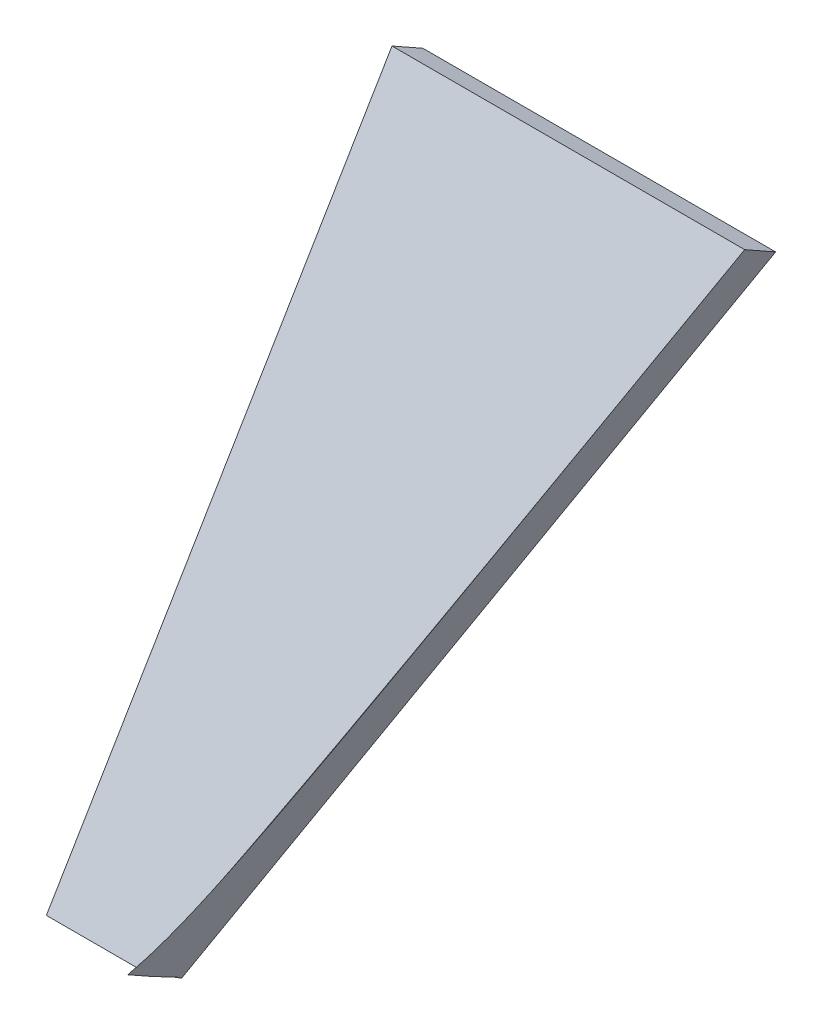
ISO-10303-21;
HEADER;
FILE_DESCRIPTION(('STEP AP214'),'2;1');
FILE_NAME('part.step','',(''),(''),'','','');
FILE_SCHEMA(('AUTOMOTIVE_DESIGN { 1 0 10303 214 1 1 1 1 }'));
ENDSEC;
DATA;
#1=APPLICATION_CONTEXT('core data for automotive mechanical design processes');
#2=APPLICATION_PROTOCOL_DEFINITION('international standard','automotive_design',2000,#1);
#3=PRODUCT_CONTEXT('',#1,'mechanical');
#4=PRODUCT('Part','Part','',(#3));
#5=PRODUCT_RELATED_PRODUCT_CATEGORY('part','',(#4));
#6=PRODUCT_DEFINITION_FORMATION('','',#4);
#7=PRODUCT_DEFINITION_CONTEXT('part definition',#1,'design');
#8=PRODUCT_DEFINITION('design','',#6,#7);
#9=PRODUCT_DEFINITION_SHAPE('','',#8);
#10=(LENGTH_UNIT() NAMED_UNIT(*) SI_UNIT(.MILLI.,.METRE.));
#11=(NAMED_UNIT(*) PLANE_ANGLE_UNIT() SI_UNIT($,.RADIAN.));
#12=(NAMED_UNIT(*) SI_UNIT($,.STERADIAN.) SOLID_ANGLE_UNIT());
#13=UNCERTAINTY_MEASURE_WITH_UNIT(LENGTH_MEASURE(1.E-05),#10,'distance_accuracy_value','');
#14=(GEOMETRIC_REPRESENTATION_CONTEXT(3) GLOBAL_UNCERTAINTY_ASSIGNED_CONTEXT((#13)) GLOBAL_UNIT_ASSIGNED_CONTEXT((#10,
#11,#12)) REPRESENTATION_CONTEXT('',''));
#15=CARTESIAN_POINT('',(0.,0.,0.));
#16=DIRECTION('',(0.,0.,1.));
#17=DIRECTION('',(1.,0.,0.));
#18=AXIS2_PLACEMENT_3D('',#15,#16,#17);
#19=CARTESIAN_POINT('',(48.6776760325675,362.607329490371,21.4180803513587));
#20=DIRECTION('',(0.915166256682117,0.0180699960875279,0.402671327352517));
#21=DIRECTION('',(0.402737084535447,0.,-0.91531570550269));
#22=AXIS2_PLACEMENT_3D('',#19,#20,#21);
#23=PLANE('',#22);
#24=DIRECTION('',(0.386982631379482,-0.318859858880206,-0.865201036410329));
#25=VECTOR('',#24,1.);
#26=CARTESIAN_POINT('',(23.4275750295006,39.9147073013639,93.2858615179995));
#27=LINE('',#26,#25);
#28=CARTESIAN_POINT('',(33.7053515526385,31.4461867373069,70.3072000000032));
#29=VERTEX_POINT('',#28);
#30=CARTESIAN_POINT('',(29.0416436027537,35.2889154237541,80.7341407062869));
#31=VERTEX_POINT('',#30);
#32=EDGE_CURVE('E110',#29,#31,#27,.F.);
#33=ORIENTED_EDGE('',*,*,#32,.T.);
#34=DIRECTION('',(0.132448179385618,0.930040822643922,-0.342755813945221));
#35=VECTOR('',#34,1.);
#36=CARTESIAN_POINT('',(72.3987098741328,339.738865355184,-31.4673754569251));
#37=LINE('',#36,#35);
#38=CARTESIAN_POINT('',(76.0658040141246,365.488915423754,-40.9572592937362));
#39=VERTEX_POINT('',#38);
#40=EDGE_CURVE('E111',#31,#39,#37,.T.);
#41=ORIENTED_EDGE('',*,*,#40,.T.);
#42=DIRECTION('',(0.386982631379482,-0.318859858880206,-0.865201036410329));
#43=VECTOR('',#42,1.);
#44=CARTESIAN_POINT('',(106.513451062562,340.401142345952,-109.030949548665));
#45=LINE('',#44,#43);
#46=CARTESIAN_POINT('',(80.7295119640094,361.646186737307,-51.3842000000199));
#47=VERTEX_POINT('',#46);
#48=EDGE_CURVE('E178',#39,#47,#45,.T.);
#49=ORIENTED_EDGE('',*,*,#48,.T.);
#50=DIRECTION('',(0.132448179385618,0.930040822643922,-0.342755813945221));
#51=VECTOR('',#50,1.);
#52=CARTESIAN_POINT('',(76.9806046329947,335.321650799356,-41.6825960247318));
#53=LINE('',#52,#51);
#54=EDGE_CURVE('E102',#29,#47,#53,.T.);
#55=ORIENTED_EDGE('',*,*,#54,.F.);
#56=EDGE_LOOP('',(#33,#41,#49,#55));
#57=FACE_BOUND('',#56,.T.);
#58=ADVANCED_FACE('F38',(#57),#23,.F.);
#59=CARTESIAN_POINT('',(159.440890218229,313.348268491755,89.3256315210229));
#60=DIRECTION('',(-0.843459103537497,0.255501074852022,-0.472541999624567));
#61=DIRECTION('',(-0.488764700454788,0.,0.872415650701741));
#62=AXIS2_PLACEMENT_3D('',#59,#60,#61);
#63=PLANE('',#62);
#64=CARTESIAN_POINT('',(248.225430882982,365.488915423754,-40.9572592937362));
#65=DIRECTION('',(0.387961074909248,-0.318717649307973,-0.864815161970962));
#66=VECTOR('',#65,1.);
#67=LINE('',#64,#66);
#68=CARTESIAN_POINT('',(248.225430882982,365.488915423754,-40.9572592937363));
#69=VERTEX_POINT('',#68);
#70=CARTESIAN_POINT('',(252.903016686641,361.646186737307,-51.3842000000199));
#71=VERTEX_POINT('',#70);
#72=EDGE_CURVE('E125',#69,#71,#67,.T.);
#73=ORIENTED_EDGE('',*,*,#72,.F.);
#74=CARTESIAN_POINT('',(76.4650627459342,37.7570445086745,88.4217184450691));
#75=CARTESIAN_POINT('',(76.9237098494051,38.4218058241165,87.9624939860993));
#76=CARTESIAN_POINT('',(77.3802011448807,39.0930954947955,87.5106473637279));
#77=CARTESIAN_POINT('',(78.2890693038996,40.4472888391063,86.6205777657977));
#78=CARTESIAN_POINT('',(78.7414465188904,41.1301915061131,86.1823536186491));
#79=CARTESIAN_POINT('',(79.6412052508016,42.5045153004235,85.3194282340254));
#80=CARTESIAN_POINT('',(80.0885966175857,43.1959100300691,84.8946951420546));
#81=CARTESIAN_POINT('',(80.9798239559399,44.5877723079918,84.0564807524007));
#82=CARTESIAN_POINT('',(81.4236598421538,45.288240073035,83.6429997242777));
#83=CARTESIAN_POINT('',(82.30744130296,46.6962630233919,82.8268137731272));
#84=CARTESIAN_POINT('',(82.7473912035108,47.4038077504963,82.4240954738224));
#85=CARTESIAN_POINT('',(83.6242375226161,48.8259813429855,81.6279395151044));
#86=CARTESIAN_POINT('',(84.0611338986766,49.5406103066242,81.2345019846662));
#87=CARTESIAN_POINT('',(85.3671210385411,51.693097272229,80.0672321772355));
#88=CARTESIAN_POINT('',(86.2320043160742,53.1403459400929,79.3059874963373));
#89=CARTESIAN_POINT('',(87.9521386012138,56.0543540205828,77.8112405193988));
#90=CARTESIAN_POINT('',(88.8073908872444,57.5211107859452,77.0777345100861));
#91=CARTESIAN_POINT('',(90.5099518978086,60.4704469897608,75.6334565113988));
#92=CARTESIAN_POINT('',(91.3572601641908,61.9530273303822,74.9226858275944));
#93=CARTESIAN_POINT('',(93.0431429167668,64.927290403516,73.5216553507168));
#94=CARTESIAN_POINT('',(93.8817334200428,66.4189429704802,72.8313506577536));
#95=CARTESIAN_POINT('',(95.5535519531764,69.4129557991991,71.4661025615243));
#96=CARTESIAN_POINT('',(96.3867781917259,70.9153193172114,70.7911641162778));
#97=CARTESIAN_POINT('',(98.048712969516,73.9288584356204,69.4541156963437));
#98=CARTESIAN_POINT('',(98.8774201644039,75.440036408096,68.7920094038161));
#99=CARTESIAN_POINT('',(100.53097516091,78.4696289745528,67.4785984088088));
#100=CARTESIAN_POINT('',(101.355822149463,79.9880449681219,66.8272959143518));
#101=CARTESIAN_POINT('',(103.002168396385,83.0307892595564,65.5338631759603));
#102=CARTESIAN_POINT('',(103.823667339026,84.5551180897171,64.8917337833899));
#103=CARTESIAN_POINT('',(105.463712559817,87.6085637051137,63.6153341502717));
#104=CARTESIAN_POINT('',(106.282258942264,89.1376803175894,62.9810636301499));
#105=CARTESIAN_POINT('',(108.071327970023,92.4894126104915,61.599947548646));
#106=CARTESIAN_POINT('',(109.041332559426,94.312873930306,60.8544839189142));
#107=CARTESIAN_POINT('',(110.978207966157,97.9642393356099,59.3715524354702));
#108=CARTESIAN_POINT('',(111.945079303277,99.792142585794,58.6340832023166));
#109=CARTESIAN_POINT('',(113.876218877387,103.451711934485,57.1658256665849));
#110=CARTESIAN_POINT('',(114.840487388684,105.283377597543,56.43503663894));
#111=CARTESIAN_POINT('',(116.766858304653,108.949937890108,54.9790708398144));
#112=CARTESIAN_POINT('',(117.728960818989,110.784832347361,54.253893779454));
#113=CARTESIAN_POINT('',(119.651363181058,114.457432587176,52.8082773798162));
#114=CARTESIAN_POINT('',(120.611663026165,116.295138373827,52.0878380474387));
#115=CARTESIAN_POINT('',(122.531349526701,119.974153418643,50.6505377503055));
#116=CARTESIAN_POINT('',(123.49073516085,121.81546425474,49.9336794616554));
#117=CARTESIAN_POINT('',(125.408213378298,125.50021386011,48.5034214652317));
#118=CARTESIAN_POINT('',(126.366305903981,127.343652717826,47.7900219081212));
#119=CARTESIAN_POINT('',(128.281364728174,131.032351826791,46.3662178600927));
#120=CARTESIAN_POINT('',(129.238330990905,132.877612132652,45.6558134625657));
#121=CARTESIAN_POINT('',(131.151274778013,136.569692251643,44.237612723833));
#122=CARTESIAN_POINT('',(132.107252284831,138.416512091444,43.5298164283898));
#123=CARTESIAN_POINT('',(134.018329919515,142.11148896655,42.1165129211272));
#124=CARTESIAN_POINT('',(134.973430044647,143.959646005988,41.4110057164234));
#125=CARTESIAN_POINT('',(138.303149521347,150.407392784346,38.9539204763245));
#126=CARTESIAN_POINT('',(140.675778333195,155.009982991742,37.207517773007));
#127=CARTESIAN_POINT('',(145.417508627697,164.220283932487,33.7237770797896));
#128=CARTESIAN_POINT('',(147.786610174765,168.827994569578,31.9864389228679));
#129=CARTESIAN_POINT('',(152.522165862576,178.047281688539,28.5185783131634));
#130=CARTESIAN_POINT('',(154.888620026371,182.658858136124,26.7880558006954));
#131=CARTESIAN_POINT('',(159.619510448463,191.884990171958,23.3322234222675));
#132=CARTESIAN_POINT('',(161.983946709009,196.499545756876,21.6069135504936));
#133=CARTESIAN_POINT('',(166.710542061945,205.729607604762,18.1608724422317));
#134=CARTESIAN_POINT('',(169.072701622499,210.3451131766,16.440139996411));
#135=CARTESIAN_POINT('',(173.79578263571,219.577979212638,13.0018879839825));
#136=CARTESIAN_POINT('',(176.156704083479,224.195339684038,11.2843684299955));
#137=CARTESIAN_POINT('',(180.877549607785,233.431544660472,7.85191197929654));
#138=CARTESIAN_POINT('',(183.237473682056,238.050389168838,6.13697508843112));
#139=CARTESIAN_POINT('',(187.956506804873,247.289277088235,2.70920431931747));
#140=CARTESIAN_POINT('',(190.315615853109,251.909320499721,0.996370441866665));
#141=CARTESIAN_POINT('',(195.03323000542,261.15052287566,-2.42761613509736));
#142=CARTESIAN_POINT('',(197.391735090329,265.771681868198,-4.13876878521728));
#143=CARTESIAN_POINT('',(202.108184629456,275.014810946128,-7.5596348395126));
#144=CARTESIAN_POINT('',(204.46612908433,279.63678103056,-9.26934824537951));
#145=CARTESIAN_POINT('',(209.181548447817,288.881401816009,-12.6875689392685));
#146=CARTESIAN_POINT('',(211.539023356779,293.504052516516,-14.3960762281908));
#147=CARTESIAN_POINT('',(216.253576813876,302.74993022492,-17.8120717192517));
#148=CARTESIAN_POINT('',(218.61065536215,307.373157232612,-19.5195599217525));
#149=CARTESIAN_POINT('',(223.325188864354,316.621502620752,-22.9341855325464));
#150=CARTESIAN_POINT('',(225.682643716289,321.24662115014,-24.6413226782551));
#151=CARTESIAN_POINT('',(230.397264974249,330.497282097516,-28.0548529166103));
#152=CARTESIAN_POINT('',(232.754431380169,335.122824515657,-29.761246008988));
#153=CARTESIAN_POINT('',(237.468516343273,344.37427646804,-33.1733913008018));
#154=CARTESIAN_POINT('',(239.825434900284,349.000186002534,-34.8791434997948));
#155=CARTESIAN_POINT('',(244.539056625559,358.252327296986,-38.2900892161125));
#156=CARTESIAN_POINT('',(246.895759793602,362.878559057266,-39.9952827328709));
#157=CARTESIAN_POINT('',(249.2523699291,367.504926406603,-41.7002368798003));
#158=B_SPLINE_CURVE_WITH_KNOTS('',3,(#74,#75,#76,#77,#78,#79,#80,#81,#82,#83,#84,#85,#86,#87,
#88,#89,#90,#91,#92,#93,#94,#95,#96,#97,#98,#99,#100,#101,#102,#103,#104,#105,#106,#107,#108,
#109,#110,#111,#112,#113,#114,#115,#116,#117,#118,#119,#120,#121,#122,#123,#124,#125,#126,#127,
#128,#129,#130,#131,#132,#133,#134,#135,#136,#137,#138,#139,#140,#141,#142,#143,#144,#145,#146,
#147,#148,#149,#150,#151,#152,#153,#154,#155,#156,#157),.UNSPECIFIED.,.F.,.F.,(4,2,2,2,2,2,2,2,
2,2,2,2,2,2,2,2,2,2,2,2,2,2,2,2,2,2,2,2,2,2,2,2,2,2,2,2,2,2,2,2,2,4),(0.,2.7870663288007,
5.5738922913037,8.35355733641403,11.1332889140867,13.9093878882142,16.6855254191084,
22.2346883091175,27.7831057046947,33.3318411468124,38.8673349337237,44.4045901718762,
49.9434114672593,55.4833511467075,61.0238016956651,66.5640545777319,73.1514952818573,
79.737780619928,86.3233423882586,92.9085628748712,99.4937929497782,106.08337009027,
112.673231740612,119.263297369365,125.853478083868,132.443679264238,148.837810935334,
165.231639456852,181.625324095476,198.018990442335,214.40778018347,230.7966341677,
247.185525196582,263.574422437805,279.963787577759,296.353133428769,312.742467034647,
329.131794812544,345.526083006663,361.920377120459,378.314682551759,394.709004550761),.UNSPECIFIED.);
#159=CARTESIAN_POINT('',(76.4649474943417,37.7569247347642,88.4218594113332));
#160=VERTEX_POINT('',#159);
#161=EDGE_CURVE('E101',#160,#69,#158,.T.);
#162=ORIENTED_EDGE('',*,*,#161,.F.);
#163=CARTESIAN_POINT('',(76.4645015687253,37.7566556156862,88.4225098423851));
#164=CARTESIAN_POINT('',(77.1206727624281,37.1658739689707,86.9318509935241));
#165=CARTESIAN_POINT('',(77.7864505171305,36.5978029603624,85.4363245381845));
#166=CARTESIAN_POINT('',(79.1368548606122,35.5106059722626,82.4380919211356));
#167=CARTESIAN_POINT('',(79.8214613125511,34.9914301437415,80.935394749358));
#168=CARTESIAN_POINT('',(81.2133140137253,34.0023246394659,77.9162168727887));
#169=CARTESIAN_POINT('',(81.9206405034792,33.5326022345681,76.3997050137938));
#170=CARTESIAN_POINT('',(83.356214651918,32.6474745858831,73.3587072800595));
#171=CARTESIAN_POINT('',(84.0844832248557,32.232126116247,71.8342147721315));
#172=CARTESIAN_POINT('',(84.8229527318621,31.8457880720957,70.3072000000032));
#173=B_SPLINE_CURVE_WITH_KNOTS('',3,(#163,#164,#165,#166,#167,#168,#169,#170,#171,#172),
.UNSPECIFIED.,.F.,.F.,(4,2,2,2,4),(0.,5.19751514895784,10.3896726887829,15.6027912540607,
20.8213103670181),.UNSPECIFIED.);
#174=CARTESIAN_POINT('',(84.0794722396863,32.2463858540291,71.850824236441));
#175=VERTEX_POINT('',#174);
#176=EDGE_CURVE('E83',#160,#175,#173,.T.);
#177=ORIENTED_EDGE('',*,*,#176,.T.);
#178=CARTESIAN_POINT('',(84.4759919189772,33.2170760786243,71.6679527295155));
#179=CARTESIAN_POINT('',(84.4031281758677,33.0391499723233,71.7018063891946));
#180=CARTESIAN_POINT('',(84.3303397813614,32.8611609507864,71.7354915381895));
#181=CARTESIAN_POINT('',(84.1849162112601,32.5050559368257,71.802519697102));
#182=CARTESIAN_POINT('',(84.1122810356676,32.3269399444002,71.8358627070144));
#183=CARTESIAN_POINT('',(83.904930400756,31.8177459224392,71.9306525050785));
#184=CARTESIAN_POINT('',(83.7704058225257,31.4865108839534,71.9916736879978));
#185=CARTESIAN_POINT('',(83.6361580842511,31.1550511361274,72.0520792290077));
#186=B_SPLINE_CURVE_WITH_KNOTS('',3,(#178,#179,#180,#181,#182,#183,#184,#185),.UNSPECIFIED.,.F.,
.F.,(4,2,2,4),(0.,0.585675611794022,1.17135123232062,2.25939010699336),.UNSPECIFIED.);
#187=CARTESIAN_POINT('',(83.9913918450094,32.0298474875026,71.8910062584913));
#188=VERTEX_POINT('',#187);
#189=EDGE_CURVE('E109',#175,#188,#186,.T.);
#190=ORIENTED_EDGE('',*,*,#189,.T.);
#191=DIRECTION('',(-0.387960554738965,0.318717725023184,0.864815367418203));
#192=VECTOR('',#191,1.);
#193=CARTESIAN_POINT('',(66.6964539925739,46.2380422597703,110.443731369652));
#194=LINE('',#193,#192);
#195=CARTESIAN_POINT('',(84.7019052855513,31.4461867373069,70.3072000000032));
#196=VERTEX_POINT('',#195);
#197=EDGE_CURVE('E105',#188,#196,#194,.F.);
#198=ORIENTED_EDGE('',*,*,#197,.T.);
#199=DIRECTION('',(-0.431238885415012,-0.846576369371367,0.311995952742999));
#200=VECTOR('',#199,1.);
#201=CARTESIAN_POINT('',(198.957925128141,255.745176760147,-12.3556047076606));
#202=LINE('',#201,#200);
#203=EDGE_CURVE('E78',#71,#196,#202,.T.);
#204=ORIENTED_EDGE('',*,*,#203,.F.);
#205=EDGE_LOOP('',(#73,#162,#177,#190,#198,#204));
#206=FACE_BOUND('',#205,.T.);
#207=ADVANCED_FACE('F106',(#206),#63,.F.);
#208=CARTESIAN_POINT('',(252.903016686641,361.646186737307,-51.3842000000199));
#209=DIRECTION('',(0.,0.938307375143637,-0.345802356485694));
#210=DIRECTION('',(-1.,0.,0.));
#211=AXIS2_PLACEMENT_3D('',#208,#209,#210);
#212=PLANE('',#211);
#213=ORIENTED_EDGE('',*,*,#48,.F.);
#214=DIRECTION('',(1.,0.,0.));
#215=VECTOR('',#214,1.);
#216=CARTESIAN_POINT('',(0.,365.488915423754,-40.9572592937362));
#217=LINE('',#216,#215);
#218=EDGE_CURVE('E11',#69,#39,#217,.F.);
#219=ORIENTED_EDGE('',*,*,#218,.F.);
#220=ORIENTED_EDGE('',*,*,#72,.T.);
#221=DIRECTION('',(-1.,0.,0.));
#222=VECTOR('',#221,1.);
#223=CARTESIAN_POINT('',(252.903016686641,361.646186737307,-51.3842000000199));
#224=LINE('',#223,#222);
#225=EDGE_CURVE('E100',#71,#47,#224,.T.);
#226=ORIENTED_EDGE('',*,*,#225,.T.);
#227=EDGE_LOOP('',(#213,#219,#220,#226));
#228=FACE_BOUND('',#227,.T.);
#229=ADVANCED_FACE('F147',(#228),#212,.T.);
#230=CARTESIAN_POINT('',(76.1040017022596,37.1987150096687,80.030306105047));
#231=CARTESIAN_POINT('',(75.7184787465366,36.5615289476017,80.265133676075));
#232=CARTESIAN_POINT('',(75.3318614791169,35.924918810988,80.4997489964223));
#233=CARTESIAN_POINT('',(74.9440913316797,35.2889154237573,80.7341407062856));
#234=B_SPLINE_CURVE_WITH_KNOTS('',3,(#230,#231,#232,#233),.UNSPECIFIED.,.F.,.F.,(4,4),(0.,1.),.UNSPECIFIED.);
#235=DIRECTION('',(-0.670569491439969,0.318916473141183,0.669797611453736));
#236=VECTOR('',#235,1.);
#237=SURFACE_OF_LINEAR_EXTRUSION('',#234,#236);
#238=ORIENTED_EDGE('',*,*,#189,.F.);
#239=CARTESIAN_POINT('',(76.103720618774,37.1981033290765,80.0304503787422));
#240=CARTESIAN_POINT('',(76.4185833888721,36.9761157984924,79.7027208289693));
#241=CARTESIAN_POINT('',(76.734544015875,36.7565407630736,79.3744103907981));
#242=CARTESIAN_POINT('',(77.3710130697318,36.3207044344757,78.7142223627048));
#243=CARTESIAN_POINT('',(77.691537846979,36.1044797528686,78.3823363671488));
#244=CARTESIAN_POINT('',(78.3371940167851,35.6755495941761,77.7149972004301));
#245=CARTESIAN_POINT('',(78.6623419493177,35.4628818467664,77.3795357757947));
#246=CARTESIAN_POINT('',(79.3173001290772,35.0412782955754,76.7050456596863));
#247=CARTESIAN_POINT('',(79.6471270793104,34.832381392931,76.3660088677898));
#248=CARTESIAN_POINT('',(80.3114968871625,34.4185391718917,75.6843679609377));
#249=CARTESIAN_POINT('',(80.6460565922014,34.2136339786535,75.3417559008497));
#250=CARTESIAN_POINT('',(81.3199427585015,33.8080021056658,74.6529644152));
#251=CARTESIAN_POINT('',(81.6592861886519,33.6073168328179,74.3067772025378));
#252=CARTESIAN_POINT('',(82.3427881894011,33.2103590449868,73.6108353672837));
#253=CARTESIAN_POINT('',(82.6869638297622,33.0141292792329,73.2610731189777));
#254=CARTESIAN_POINT('',(83.3801743793942,32.6263247959761,72.5579812546003));
#255=CARTESIAN_POINT('',(83.7292264258763,32.4347942389901,72.2046441790141));
#256=CARTESIAN_POINT('',(84.0794609481138,32.2463986045097,71.8508062723878));
#257=B_SPLINE_CURVE_WITH_KNOTS('',3,(#239,#240,#241,#242,#243,#244,#245,#246,#247,#248,#249,
#250,#251,#252,#253,#254,#255,#256),.UNSPECIFIED.,.F.,.F.,(4,2,2,2,2,2,2,2,4),(0.,
1.51736470139841,3.04597314317774,4.58585847777646,6.1370580416777,7.69961379431085,
9.27357279436505,10.8589877166567,12.455917412912),.UNSPECIFIED.);
#258=CARTESIAN_POINT('',(76.1040017022596,37.1987150096687,80.030306105047));
#259=VERTEX_POINT('',#258);
#260=EDGE_CURVE('E119',#259,#175,#257,.T.);
#261=ORIENTED_EDGE('',*,*,#260,.F.);
#262=CARTESIAN_POINT('',(76.1040017022596,37.1987150096687,80.030306105047));
#263=CARTESIAN_POINT('',(75.7184787465366,36.5615289476017,80.2651336760749));
#264=CARTESIAN_POINT('',(75.3318614791169,35.924918810988,80.4997489964223));
#265=CARTESIAN_POINT('',(74.9440913316797,35.2889154237573,80.7341407062856));
#266=B_SPLINE_CURVE_WITH_KNOTS('',3,(#262,#263,#264,#265),.UNSPECIFIED.,.F.,.F.,(4,4),(0.,1.),.UNSPECIFIED.);
#267=CARTESIAN_POINT('',(74.944091331686,35.2889154237541,80.7341407062869));
#268=VERTEX_POINT('',#267);
#269=EDGE_CURVE('E117',#268,#259,#266,.F.);
#270=ORIENTED_EDGE('',*,*,#269,.F.);
#271=CARTESIAN_POINT('',(74.9440913316825,35.2889154237559,80.7341407062827));
#272=CARTESIAN_POINT('',(75.321087550685,35.1531071377622,80.3656847919879));
#273=CARTESIAN_POINT('',(75.6980820841164,35.0172999968518,79.9972267309896));
#274=CARTESIAN_POINT('',(76.4520646899436,34.7456891154144,79.2603093557925));
#275=CARTESIAN_POINT('',(76.8290527623671,34.6098853748687,78.891850041629));
#276=CARTESIAN_POINT('',(77.5830224636236,34.3382812849796,78.1549301634853));
#277=CARTESIAN_POINT('',(77.9600040924842,34.2024809356175,77.7864695995402));
#278=CARTESIAN_POINT('',(78.7139609240605,33.9308836189142,77.0495472252172));
#279=CARTESIAN_POINT('',(79.0909361268036,33.7950866515543,76.6810854148741));
#280=CARTESIAN_POINT('',(79.8448801235903,33.5234960896741,75.9441605511391));
#281=CARTESIAN_POINT('',(80.2218489176611,33.3877024951353,75.5756974977817));
#282=CARTESIAN_POINT('',(80.9757801145489,33.1161186697157,74.838770151402));
#283=CARTESIAN_POINT('',(81.3527425173929,32.9803284388165,74.470305858414));
#284=CARTESIAN_POINT('',(82.1066609492722,32.7087513314949,73.7333760361568));
#285=CARTESIAN_POINT('',(82.4836169783346,32.5729644550542,73.3649105069219));
#286=CARTESIAN_POINT('',(83.2375226800963,32.3013940474679,72.6279782155547));
#287=CARTESIAN_POINT('',(83.6144723528225,32.1656105163041,72.2595114534566));
#288=CARTESIAN_POINT('',(83.9914203759821,32.0298281057092,71.8910425908979));
#289=B_SPLINE_CURVE_WITH_KNOTS('',3,(#271,#272,#273,#274,#275,#276,#277,#278,#279,#280,#281,
#282,#283,#284,#285,#286,#287,#288),.UNSPECIFIED.,.F.,.F.,(4,2,2,2,2,2,2,2,4),(0.,
1.63308548587105,3.26615754793747,4.8992162226361,6.53226154640214,8.16529355566937,
9.79831228686991,11.4313177764344,13.064310060792),.UNSPECIFIED.);
#290=EDGE_CURVE('E69',#268,#188,#289,.T.);
#291=ORIENTED_EDGE('',*,*,#290,.T.);
#292=EDGE_LOOP('',(#238,#261,#270,#291));
#293=FACE_BOUND('',#292,.T.);
#294=ADVANCED_FACE('F148',(#293),#237,.F.);
#295=CARTESIAN_POINT('',(-34.9249999999667,31.4461867373069,70.3072000000032));
#296=DIRECTION('',(0.,0.938307375143637,-0.345802356485694));
#297=DIRECTION('',(-1.,0.,0.));
#298=AXIS2_PLACEMENT_3D('',#295,#296,#297);
#299=PLANE('',#298);
#300=ORIENTED_EDGE('',*,*,#32,.F.);
#301=DIRECTION('',(-1.,0.,0.));
#302=VECTOR('',#301,1.);
#303=CARTESIAN_POINT('',(-34.9249999999667,31.4461867373069,70.3072000000032));
#304=LINE('',#303,#302);
#305=EDGE_CURVE('E98',#196,#29,#304,.T.);
#306=ORIENTED_EDGE('',*,*,#305,.F.);
#307=ORIENTED_EDGE('',*,*,#197,.F.);
#308=ORIENTED_EDGE('',*,*,#290,.F.);
#309=DIRECTION('',(1.,0.,0.));
#310=VECTOR('',#309,1.);
#311=CARTESIAN_POINT('',(0.,35.2889154237541,80.7341407062869));
#312=LINE('',#311,#310);
#313=EDGE_CURVE('E48',#268,#31,#312,.F.);
#314=ORIENTED_EDGE('',*,*,#313,.T.);
#315=EDGE_LOOP('',(#300,#306,#307,#308,#314));
#316=FACE_BOUND('',#315,.T.);
#317=ADVANCED_FACE('F114',(#316),#299,.F.);
#318=CARTESIAN_POINT('',(0.,348.816340498756,-34.8127741809915));
#319=DIRECTION('',(0.,0.345802356485694,0.938307375143637));
#320=DIRECTION('',(0.,-0.938307375143637,0.345802356485694));
#321=AXIS2_PLACEMENT_3D('',#318,#319,#320);
#322=PLANE('',#321);
#323=ORIENTED_EDGE('',*,*,#40,.F.);
#324=ORIENTED_EDGE('',*,*,#313,.F.);
#325=ORIENTED_EDGE('',*,*,#269,.T.);
#326=CARTESIAN_POINT('',(268.631680721576,405.568697329178,-55.7282004559611));
#327=CARTESIAN_POINT('',(266.475876545784,401.33250053035,-54.1669990049464));
#328=CARTESIAN_POINT('',(264.319836813196,397.096409264806,-52.6058364470061));
#329=CARTESIAN_POINT('',(260.007235771978,388.624460590243,-49.4835975162491));
#330=CARTESIAN_POINT('',(257.850674463359,384.388603181219,-47.9225211434309));
#331=CARTESIAN_POINT('',(253.536979769386,375.917144934433,-44.8004629541727));
#332=CARTESIAN_POINT('',(251.379846384044,371.681544096667,-43.2394811377308));
#333=CARTESIAN_POINT('',(247.064948355213,363.210625603667,-40.1176218685023));
#334=CARTESIAN_POINT('',(244.907183711735,358.975307948429,-38.5567444157139));
#335=CARTESIAN_POINT('',(240.591316640052,350.505693378278,-35.4353656922063));
#336=CARTESIAN_POINT('',(238.433214328483,346.271396411039,-33.8748644022027));
#337=CARTESIAN_POINT('',(234.116234673154,337.803150255581,-30.7539899921408));
#338=CARTESIAN_POINT('',(231.957357329383,333.569201067368,-29.1936168720843));
#339=CARTESIAN_POINT('',(227.638739405691,325.101690086685,-26.0730134022026));
#340=CARTESIAN_POINT('',(225.478998825735,320.868128294231,-24.5127830523834));
#341=CARTESIAN_POINT('',(221.158550957276,312.401438600431,-21.3924822583063));
#342=CARTESIAN_POINT('',(218.997843668694,308.168310699121,-19.8324118140615));
#343=CARTESIAN_POINT('',(212.514074560245,295.469606792795,-15.152451012891));
#344=CARTESIAN_POINT('',(208.189390633974,287.004759876395,-12.0328293531617));
#345=CARTESIAN_POINT('',(199.534510484506,270.077547421222,-5.7945005167964));
#346=CARTESIAN_POINT('',(195.204314261547,261.615181882342,-2.675793340121));
#347=CARTESIAN_POINT('',(188.703252653298,248.923388673028,2.00162060340507));
#348=CARTESIAN_POINT('',(186.535094633815,244.692740029914,3.56077734564823));
#349=CARTESIAN_POINT('',(182.196687029861,236.23238654979,6.67874300128513));
#350=CARTESIAN_POINT('',(180.026437445225,232.002681712854,8.23755191465158));
#351=CARTESIAN_POINT('',(175.683511936241,223.544365974487,11.3547665840766));
#352=CARTESIAN_POINT('',(173.510836010575,219.315755073652,12.9131723399155));
#353=CARTESIAN_POINT('',(169.162646184582,210.859811997455,16.0295125920747));
#354=CARTESIAN_POINT('',(166.987132281009,206.632479823562,17.5874470878533));
#355=CARTESIAN_POINT('',(162.990515524075,198.873840579822,20.4468040583739));
#356=CARTESIAN_POINT('',(161.169916888996,195.342304846645,21.7483108043473));
#357=CARTESIAN_POINT('',(157.526021362263,188.280457337567,24.3508732209626));
#358=CARTESIAN_POINT('',(155.70272446954,184.750145562152,25.6519288914254));
#359=CARTESIAN_POINT('',(152.052996899251,177.69095074806,28.2535136879115));
#360=CARTESIAN_POINT('',(150.22656622342,174.162067708594,29.5540428142256));
#361=CARTESIAN_POINT('',(146.570037791319,167.105979721041,32.1544826256391));
#362=CARTESIAN_POINT('',(144.739940039455,163.578774770943,33.4543933114794));
#363=CARTESIAN_POINT('',(141.075419507209,156.526349159797,36.0534833963261));
#364=CARTESIAN_POINT('',(139.240996732791,153.001128496021,37.3526627963379));
#365=CARTESIAN_POINT('',(135.567006509556,145.953051356762,39.9501503020452));
#366=CARTESIAN_POINT('',(133.727439064946,142.430194879349,41.2484584084521));
#367=CARTESIAN_POINT('',(130.042883822314,135.388766750694,43.8434954980207));
#368=CARTESIAN_POINT('',(128.197898550448,131.87019393596,45.140224909974));
#369=CARTESIAN_POINT('',(124.500457107902,124.836509003421,47.7324083339587));
#370=CARTESIAN_POINT('',(122.648000944413,121.321396882289,49.0278623472162));
#371=CARTESIAN_POINT('',(118.933939535326,114.295419793752,51.6172051342305));
#372=CARTESIAN_POINT('',(117.072334270562,110.784554835265,52.911093904701));
#373=CARTESIAN_POINT('',(113.337793723252,103.768093346925,55.4969298270582));
#374=CARTESIAN_POINT('',(111.464858343544,100.262496862575,56.7888769621753));
#375=CARTESIAN_POINT('',(107.704783787319,93.2579195475823,59.3703331095704));
#376=CARTESIAN_POINT('',(105.817644308853,89.758938859566,60.659842069285));
#377=CARTESIAN_POINT('',(102.02535484167,82.7693683226842,63.2357676417625));
#378=CARTESIAN_POINT('',(100.120204039488,79.2787788618178,64.5221841115328));
#379=CARTESIAN_POINT('',(97.2445215206008,74.0499953403427,66.4491919462552));
#380=CARTESIAN_POINT('',(96.2826172907139,72.3076229135517,67.0913231998519));
#381=CARTESIAN_POINT('',(94.3522335054647,68.8260882076086,68.3744026441732));
#382=CARTESIAN_POINT('',(93.3837539559389,67.0869259256088,69.0153508359473));
#383=CARTESIAN_POINT('',(91.4393353711678,63.612340461099,70.2958692175219));
#384=CARTESIAN_POINT('',(90.463396556735,61.8769171698403,70.9354394474005));
#385=CARTESIAN_POINT('',(88.5030157450875,58.4104172336313,72.2129780008143));
#386=CARTESIAN_POINT('',(87.5185741912027,56.679340368062,72.8509464056562));
#387=CARTESIAN_POINT('',(85.5399700263339,53.2222276111596,74.1250254224502));
#388=CARTESIAN_POINT('',(84.545808054706,51.4961913978498,74.7611361530632));
#389=CARTESIAN_POINT('',(82.5463419741549,48.0499552108452,76.0312067355203));
#390=CARTESIAN_POINT('',(81.5410386106958,46.3297548566159,76.665166727606));
#391=CARTESIAN_POINT('',(79.5169194694517,42.8948803128609,77.9310501075393));
#392=CARTESIAN_POINT('',(78.4980952138806,41.1802105183254,78.562971875664));
#393=CARTESIAN_POINT('',(76.4457136559397,37.7586554018887,79.8239465343449));
#394=CARTESIAN_POINT('',(75.4121564221374,36.0517700438074,80.4529994382349));
#395=CARTESIAN_POINT('',(73.3281270282855,32.6469966172462,81.707789398747));
#396=CARTESIAN_POINT('',(72.2776540606729,30.9491089834943,82.3335262951552));
#397=CARTESIAN_POINT('',(70.1573138460054,27.5637116966294,83.5811754029531));
#398=CARTESIAN_POINT('',(69.0874440018572,25.8762034743595,84.2030870870221));
#399=CARTESIAN_POINT('',(66.9255126064473,22.5131059495944,85.4425178748031));
#400=CARTESIAN_POINT('',(65.8334451675576,20.8375199727137,86.0600357528982));
#401=CARTESIAN_POINT('',(64.1765074729942,18.3345912508188,86.9824612534059));
#402=CARTESIAN_POINT('',(63.6209235523937,17.5018301512263,87.2893657478789));
#403=CARTESIAN_POINT('',(62.5031668992113,15.8402010448257,87.9017399823994));
#404=CARTESIAN_POINT('',(61.9409941111686,15.0113330708699,88.2072097103397));
#405=CARTESIAN_POINT('',(61.3753364632381,14.1845568541319,88.5119085452931));
#406=B_SPLINE_CURVE_WITH_KNOTS('',3,(#326,#327,#328,#329,#330,#331,#332,#333,#334,#335,#336,
#337,#338,#339,#340,#341,#342,#343,#344,#345,#346,#347,#348,#349,#350,#351,#352,#353,#354,#355,
#356,#357,#358,#359,#360,#361,#362,#363,#364,#365,#366,#367,#368,#369,#370,#371,#372,#373,#374,
#375,#376,#377,#378,#379,#380,#381,#382,#383,#384,#385,#386,#387,#388,#389,#390,#391,#392,#393,
#394,#395,#396,#397,#398,#399,#400,#401,#402,#403,#404,#405),.UNSPECIFIED.,.F.,.F.,(4,2,2,2,2,2,
2,2,2,2,2,2,2,2,2,2,2,2,2,2,2,2,2,2,2,2,2,2,2,2,2,2,2,2,2,2,2,2,2,4),(0.,15.0090587481091,
30.0181172111337,45.0271753704503,60.0362332779497,75.0427839816924,90.0493348880202,
105.055886416762,120.062439171757,150.075719389616,180.088998313329,195.098075204426,
210.107153272915,225.116239497434,240.125342903305,252.668156457352,265.210974985272,
277.753786572767,290.296583095452,302.839362331964,315.382131315954,327.919767577916,
340.457391775206,352.995042249452,365.532800394191,378.070825821749,390.609420249796,
396.883251106823,403.157076395698,409.430716677805,415.704031805701,421.976937048309,
428.249425078397,434.526051665116,440.802649049918,447.079546975244,453.357291628301,
459.636723680745,462.777907015592,465.91911680994),.UNSPECIFIED.);
#407=EDGE_CURVE('E254',#259,#69,#406,.F.);
#408=ORIENTED_EDGE('',*,*,#407,.T.);
#409=ORIENTED_EDGE('',*,*,#218,.T.);
#410=EDGE_LOOP('',(#323,#324,#325,#408,#409));
#411=FACE_BOUND('',#410,.T.);
#412=ADVANCED_FACE('F189',(#411),#322,.T.);
#413=CARTESIAN_POINT('',(85.6986424179436,31.3769951537859,98.8702406093947));
#414=CARTESIAN_POINT('',(85.7027247971248,31.3821256341456,89.3492268798434));
#415=CARTESIAN_POINT('',(85.7069644966226,31.3883635709842,79.828212256753));
#416=CARTESIAN_POINT('',(85.7108154236448,31.3959645393255,70.3072000000032));
#417=CARTESIAN_POINT('',(85.6116867373077,31.4461867373069,98.8702406093947));
#418=CARTESIAN_POINT('',(85.6116867373077,31.4461867373069,89.3492270729307));
#419=CARTESIAN_POINT('',(85.6116867373077,31.4461867373069,79.8282135364671));
#420=CARTESIAN_POINT('',(85.6116867373077,31.4461867373069,70.3072000000032));
#421=CARTESIAN_POINT('',(76.9161186737156,38.365345089407,98.8702406093947));
#422=CARTESIAN_POINT('',(76.5078807556021,37.8522970534392,89.3492463816686));
#423=CARTESIAN_POINT('',(76.0839108058149,37.2285033695762,79.8283415078823));
#424=CARTESIAN_POINT('',(75.6988181035992,36.4684065354477,70.3072000000032));
#425=B_SPLINE_SURFACE_WITH_KNOTS('',1,3,((#413,#414,#415,#416),(#417,#418,#419,#420),(#421,#422,
#423,#424)),.UNSPECIFIED.,.F.,.F.,.F.,(2,1,2),(4,4),(-0.01,0.,1.),(-0.0142815203046958,
0.0142815203046957),.UNSPECIFIED.);
#426=CARTESIAN_POINT('',(76.4645906860022,37.7565493926141,88.4220268575214));
#427=CARTESIAN_POINT('',(76.4494474970182,37.7346040829473,88.072364871674));
#428=CARTESIAN_POINT('',(76.4343104794144,37.7124974436662,87.722712741032));
#429=CARTESIAN_POINT('',(76.4040533360882,37.6679577717031,87.0234083656761));
#430=CARTESIAN_POINT('',(76.3889332113844,37.6455247203741,86.6737561221058));
#431=CARTESIAN_POINT('',(76.3587152632721,37.6003296937216,85.9744514869075));
#432=CARTESIAN_POINT('',(76.3436174412106,37.5775676993595,85.6247990964516));
#433=CARTESIAN_POINT('',(76.313449507329,37.5317122566988,84.9254941355542));
#434=CARTESIAN_POINT('',(76.2983793971931,37.508618788959,84.575841566315));
#435=CARTESIAN_POINT('',(76.2682722961985,37.4620978694421,83.8765362153255));
#436=CARTESIAN_POINT('',(76.2532353073706,37.4386703978096,83.5268834348086));
#437=CARTESIAN_POINT('',(76.2231998579263,37.3914789405299,82.8275776290648));
#438=CARTESIAN_POINT('',(76.208201399697,37.3677149346007,82.4779246051041));
#439=CARTESIAN_POINT('',(76.178248420487,37.3198478785605,81.7786182795581));
#440=CARTESIAN_POINT('',(76.1632939022598,37.2957448077281,81.4289649792732));
#441=CARTESIAN_POINT('',(76.1334342115651,37.2471970924974,80.7296580706922));
#442=CARTESIAN_POINT('',(76.1185290422281,37.2227524269252,80.3800044637325));
#443=CARTESIAN_POINT('',(76.1036517208319,37.1981364859986,80.0303617266531));
#444=B_SPLINE_CURVE_WITH_KNOTS('',3,(#426,#427,#428,#429,#430,#431,#432,#433,#434,#435,#436,
#437,#438,#439,#440,#441,#442,#443),.UNSPECIFIED.,.F.,.F.,(4,2,2,2,2,2,2,2,4),(0.,
1.05203121838122,2.10412277440731,3.15627546900618,4.20849012742168,5.26076760012073,
6.31310876370022,7.36551452179338,8.41798580597573),.UNSPECIFIED.);
#445=EDGE_CURVE('E57',#160,#259,#444,.T.);
#446=ORIENTED_EDGE('',*,*,#176,.F.);
#447=ORIENTED_EDGE('',*,*,#445,.T.);
#448=ORIENTED_EDGE('',*,*,#260,.T.);
#449=EDGE_LOOP('',(#446,#447,#448));
#450=FACE_BOUND('',#449,.T.);
#451=ADVANCED_FACE('F184',(#450),#425,.T.);
#452=CARTESIAN_POINT('',(85.6116867373077,31.4461867373069,98.8702406093947));
#453=CARTESIAN_POINT('',(348.355428279554,361.646186737307,43.4588001512512));
#454=CARTESIAN_POINT('',(85.6116867373077,31.4461867373069,94.1097338411627));
#455=CARTESIAN_POINT('',(332.446693014069,361.646186737307,27.6516334593728));
#456=CARTESIAN_POINT('',(85.6116867373077,31.4461867373069,89.3492270729308));
#457=CARTESIAN_POINT('',(316.537957748583,361.646186737307,11.8444667674944));
#458=CARTESIAN_POINT('',(85.6116867373077,31.4461867373069,79.828213536467));
#459=CARTESIAN_POINT('',(284.720487217612,361.646186737307,-19.7698666162626));
#460=CARTESIAN_POINT('',(85.6116867373077,31.4461867373069,75.0677067682351));
#461=CARTESIAN_POINT('',(268.811751952127,361.646186737307,-35.5770333081412));
#462=CARTESIAN_POINT('',(85.6116867373077,31.4461867373069,70.3072000000032));
#463=CARTESIAN_POINT('',(252.903016686641,361.646186737307,-51.3842000000199));
#464=B_SPLINE_SURFACE_WITH_KNOTS('',3,1,((#452,#453),(#454,#455),(#456,#457),(#458,#459),(#460,
#461),(#462,#463)),.UNSPECIFIED.,.F.,.F.,.F.,(4,2,4),(2,2),(0.,0.5,1.),(0.,1.),.UNSPECIFIED.);
#465=OFFSET_SURFACE('',#464,-11.1125,.F.);
#466=ORIENTED_EDGE('',*,*,#445,.F.);
#467=ORIENTED_EDGE('',*,*,#161,.T.);
#468=ORIENTED_EDGE('',*,*,#407,.F.);
#469=EDGE_LOOP('',(#466,#467,#468));
#470=FACE_BOUND('',#469,.T.);
#471=ADVANCED_FACE('F139',(#470),#465,.F.);
#472=CARTESIAN_POINT('',(0.,344.973611812309,-45.2397148872752));
#473=DIRECTION('',(0.,0.345802356485694,0.938307375143637));
#474=DIRECTION('',(0.,-0.938307375143637,0.345802356485694));
#475=AXIS2_PLACEMENT_3D('',#472,#473,#474);
#476=PLANE('',#475);
#477=ORIENTED_EDGE('',*,*,#305,.T.);
#478=ORIENTED_EDGE('',*,*,#54,.T.);
#479=ORIENTED_EDGE('',*,*,#225,.F.);
#480=ORIENTED_EDGE('',*,*,#203,.T.);
#481=EDGE_LOOP('',(#477,#478,#479,#480));
#482=FACE_BOUND('',#481,.T.);
#483=ADVANCED_FACE('F40',(#482),#476,.F.);
#484=CLOSED_SHELL('',(#58,#207,#229,#294,#317,#412,#451,#471,#483));
#485=MANIFOLD_SOLID_BREP('B2',#484);
#486=ADVANCED_BREP_SHAPE_REPRESENTATION('',(#18,#485),#14);
#487=SHAPE_DEFINITION_REPRESENTATION(#9,#486);
ENDSEC;
END-ISO-10303-21;
